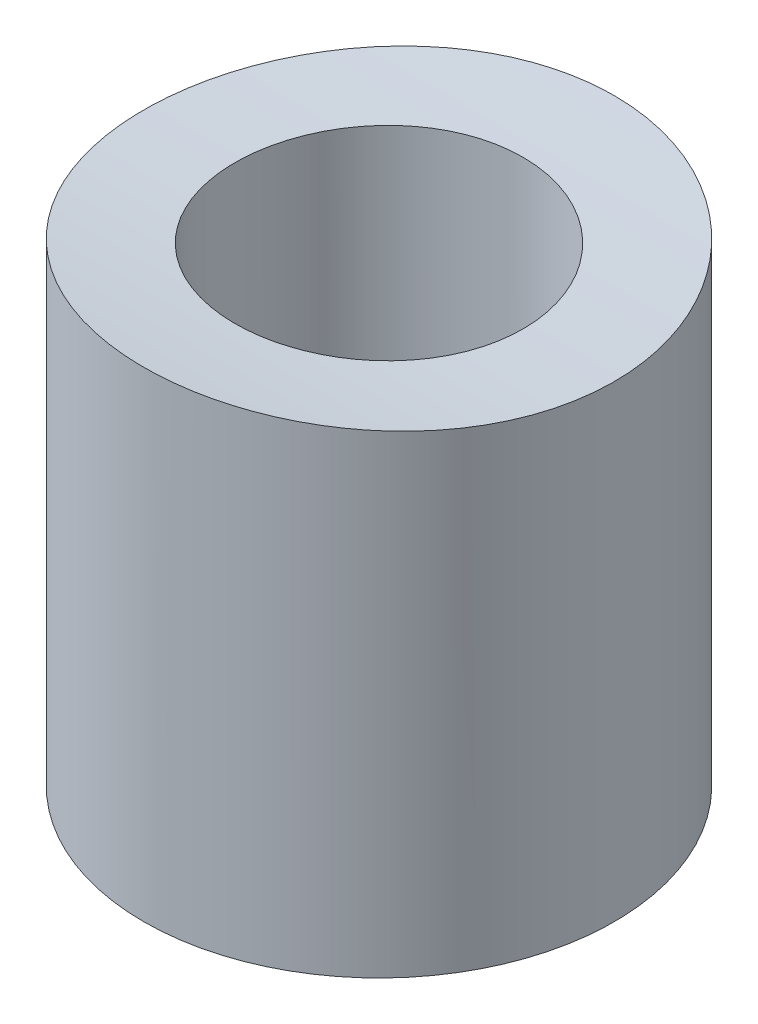
ISO-10303-21;
HEADER;
FILE_DESCRIPTION(('STEP AP214'),'2;1');
FILE_NAME('part.step','',(''),(''),'','','');
FILE_SCHEMA(('AUTOMOTIVE_DESIGN { 1 0 10303 214 1 1 1 1 }'));
ENDSEC;
DATA;
#1=APPLICATION_CONTEXT('core data for automotive mechanical design processes');
#2=APPLICATION_PROTOCOL_DEFINITION('international standard','automotive_design',2000,#1);
#3=PRODUCT_CONTEXT('',#1,'mechanical');
#4=PRODUCT('Part','Part','',(#3));
#5=PRODUCT_RELATED_PRODUCT_CATEGORY('part','',(#4));
#6=PRODUCT_DEFINITION_FORMATION('','',#4);
#7=PRODUCT_DEFINITION_CONTEXT('part definition',#1,'design');
#8=PRODUCT_DEFINITION('design','',#6,#7);
#9=PRODUCT_DEFINITION_SHAPE('','',#8);
#10=(LENGTH_UNIT() NAMED_UNIT(*) SI_UNIT(.MILLI.,.METRE.));
#11=(NAMED_UNIT(*) PLANE_ANGLE_UNIT() SI_UNIT($,.RADIAN.));
#12=(NAMED_UNIT(*) SI_UNIT($,.STERADIAN.) SOLID_ANGLE_UNIT());
#13=UNCERTAINTY_MEASURE_WITH_UNIT(LENGTH_MEASURE(1.E-05),#10,'distance_accuracy_value','');
#14=(GEOMETRIC_REPRESENTATION_CONTEXT(3) GLOBAL_UNCERTAINTY_ASSIGNED_CONTEXT((#13)) GLOBAL_UNIT_ASSIGNED_CONTEXT((#10,
#11,#12)) REPRESENTATION_CONTEXT('',''));
#15=CARTESIAN_POINT('',(0.,0.,0.));
#16=DIRECTION('',(0.,0.,1.));
#17=DIRECTION('',(1.,0.,0.));
#18=AXIS2_PLACEMENT_3D('',#15,#16,#17);
#19=CARTESIAN_POINT('',(0.,50.,0.));
#20=DIRECTION('',(0.,-1.,0.));
#21=DIRECTION('',(0.,0.,-1.));
#22=AXIS2_PLACEMENT_3D('',#19,#20,#21);
#23=CYLINDRICAL_SURFACE('',#22,24.5);
#24=CARTESIAN_POINT('',(0.,0.,0.));
#25=DIRECTION('',(0.,1.,0.));
#26=DIRECTION('',(0.,0.,1.));
#27=AXIS2_PLACEMENT_3D('',#24,#25,#26);
#28=CIRCLE('',#27,24.5);
#29=CARTESIAN_POINT('',(0.,0.,24.5));
#30=VERTEX_POINT('',#29);
#31=EDGE_CURVE('E10',#30,#30,#28,.T.);
#32=ORIENTED_EDGE('',*,*,#31,.T.);
#33=EDGE_LOOP('',(#32));
#34=FACE_BOUND('',#33,.T.);
#35=CARTESIAN_POINT('',(0.,50.,-24.5));
#36=CARTESIAN_POINT('',(0.686288295087626,50.000002021148,-24.5000069532155));
#37=CARTESIAN_POINT('',(1.37247124156527,49.9969460440604,-24.4711529936711));
#38=CARTESIAN_POINT('',(2.74016006663346,49.9848132793735,-24.3559528357226));
#39=CARTESIAN_POINT('',(3.42166479599907,49.9757350623454,-24.2695929877989));
#40=CARTESIAN_POINT('',(4.77558400723465,49.951802620348,-24.0398792992395));
#41=CARTESIAN_POINT('',(5.44798869914994,49.9369426184239,-23.8964684520386));
#42=CARTESIAN_POINT('',(6.77820592212142,49.9018751925709,-23.5537176918179));
#43=CARTESIAN_POINT('',(7.43601931533568,49.8816680855044,-23.3543810928407));
#44=CARTESIAN_POINT('',(8.73204165634782,49.8364976322271,-22.9013623837873));
#45=CARTESIAN_POINT('',(9.37026217391306,49.8115371581928,-22.647713080187));
#46=CARTESIAN_POINT('',(10.6230325562134,49.7575624516799,-22.0878227479932));
#47=CARTESIAN_POINT('',(11.2375820906608,49.7285481626634,-21.7815809858881));
#48=CARTESIAN_POINT('',(12.4385749002095,49.6672953134469,-21.1187638864147));
#49=CARTESIAN_POINT('',(13.0250239045276,49.6350574146588,-20.7621988680895));
#50=CARTESIAN_POINT('',(14.1658613855054,49.5682630934088,-20.0012131228647));
#51=CARTESIAN_POINT('',(14.7202498772364,49.5337066720367,-19.5967924184617));
#52=CARTESIAN_POINT('',(15.7950254687789,49.4631224763038,-18.7414127627031));
#53=CARTESIAN_POINT('',(16.3152843210596,49.4270898961834,-18.290293057645));
#54=CARTESIAN_POINT('',(17.3159877670831,49.3546884752986,-17.3458899272557));
#55=CARTESIAN_POINT('',(17.7964322375206,49.3183196334931,-16.8526063713525));
#56=CARTESIAN_POINT('',(18.7141556477563,49.2462709571884,-15.8273105849728));
#57=CARTESIAN_POINT('',(19.1514326070483,49.2105911543623,-15.2952965795043));
#58=CARTESIAN_POINT('',(19.9797134160076,49.1409290090768,-14.1962854554133));
#59=CARTESIAN_POINT('',(20.3707172445091,49.1069466673939,-13.6292883207894));
#60=CARTESIAN_POINT('',(21.1045316340148,49.0415623550901,-12.4629276259589));
#61=CARTESIAN_POINT('',(21.4472278904996,49.0101665752785,-11.8634917946458));
#62=CARTESIAN_POINT('',(22.0808825238466,48.9509347928541,-10.6376993684122));
#63=CARTESIAN_POINT('',(22.3718407937438,48.9230987976009,-10.0113427178381));
#64=CARTESIAN_POINT('',(22.8999042614955,48.8717783078774,-8.73616644082469));
#65=CARTESIAN_POINT('',(23.1370105884944,48.8482937221706,-8.08734728569842));
#66=CARTESIAN_POINT('',(23.555643231069,48.8063440843154,-6.77186128294522));
#67=CARTESIAN_POINT('',(23.7371697659061,48.7878790123652,-6.10519450573816));
#68=CARTESIAN_POINT('',(24.0427369466796,48.7565532741183,-4.76129163738858));
#69=CARTESIAN_POINT('',(24.1669886133669,48.7436720456101,-4.08410400265386));
#70=CARTESIAN_POINT('',(24.3580824086558,48.7237797530405,-2.72159084120125));
#71=CARTESIAN_POINT('',(24.4249246646663,48.7167686759516,-2.03626533254718));
#72=CARTESIAN_POINT('',(24.5007045245883,48.708815811678,-0.662402567701231));
#73=CARTESIAN_POINT('',(24.509643591478,48.7078738711509,0.0261346069050318));
#74=CARTESIAN_POINT('',(24.4695546474667,48.7120856435205,1.40149975460566));
#75=CARTESIAN_POINT('',(24.4205267584797,48.7172393435971,2.08832773129171));
#76=CARTESIAN_POINT('',(24.2651754634394,48.7334637780303,3.45264750029517));
#77=CARTESIAN_POINT('',(24.1590793588644,48.7445110370481,4.13016546915855));
#78=CARTESIAN_POINT('',(23.8905152784563,48.7721967600294,5.47381574641876));
#79=CARTESIAN_POINT('',(23.7280474752404,48.7888352068719,6.13994808967322));
#80=CARTESIAN_POINT('',(23.3479199768433,48.8272359181457,7.45612812557251));
#81=CARTESIAN_POINT('',(23.1302597329422,48.848998233518,8.10617565823259));
#82=CARTESIAN_POINT('',(22.6413193083486,48.8970361015369,9.38560961562939));
#83=CARTESIAN_POINT('',(22.3700389715758,48.9233116673208,10.0149959802183));
#84=CARTESIAN_POINT('',(21.7752263394678,48.9796946694264,11.2498941527251));
#85=CARTESIAN_POINT('',(21.4515941885255,49.0098094048281,11.8553575281662));
#86=CARTESIAN_POINT('',(20.7547573686808,49.0729857997939,13.0368880159689));
#87=CARTESIAN_POINT('',(20.381552658981,49.1060474617832,13.6129551041374));
#88=CARTESIAN_POINT('',(19.5881959355555,49.1741918673254,14.7316951369586));
#89=CARTESIAN_POINT('',(19.1680426375792,49.2092746661525,15.2743671674796));
#90=CARTESIAN_POINT('',(18.2837436995033,49.2804775272068,16.3225266697561));
#91=CARTESIAN_POINT('',(17.8195979098088,49.316597592961,16.8280140150562));
#92=CARTESIAN_POINT('',(16.8482062869191,49.3890373820541,17.8006354408805));
#93=CARTESIAN_POINT('',(16.3407627552299,49.425357225729,18.2675720870252));
#94=CARTESIAN_POINT('',(15.2882910641227,49.4969924207639,19.1570582316902));
#95=CARTESIAN_POINT('',(14.7432627757846,49.5323077686776,19.5796075779441));
#96=CARTESIAN_POINT('',(13.6194474707038,49.6009307474872,20.3773275832249));
#97=CARTESIAN_POINT('',(13.0406603283777,49.6342383709133,20.7524980659853));
#98=CARTESIAN_POINT('',(11.8534013624187,49.6978965266922,21.4527823208908));
#99=CARTESIAN_POINT('',(11.2449295803382,49.728247063184,21.7778961631022));
#100=CARTESIAN_POINT('',(10.0024393899622,49.7851302141949,22.3758048354382));
#101=CARTESIAN_POINT('',(9.36841461074177,49.8116618689504,22.6485865191293));
#102=CARTESIAN_POINT('',(8.079459738756,49.8601360860988,23.1397491209017));
#103=CARTESIAN_POINT('',(7.42452963097305,49.882078645195,23.3581299999026));
#104=CARTESIAN_POINT('',(6.0984540907896,49.9207414587406,23.7388859486836));
#105=CARTESIAN_POINT('',(5.42730910662739,49.937461857372,23.9012625647346));
#106=CARTESIAN_POINT('',(4.07359783989122,49.9651974422214,24.1688192657932));
#107=CARTESIAN_POINT('',(3.39103160498689,49.9762126522454,24.2739995894635));
#108=CARTESIAN_POINT('',(2.02266685989173,49.9921803614176,24.4260197099533));
#109=CARTESIAN_POINT('',(1.33689937172294,49.9971615741104,24.4731358314165));
#110=CARTESIAN_POINT('',(-0.0361858201459552,50.0010138059953,24.5095972921728));
#111=CARTESIAN_POINT('',(-0.723503518931741,49.9998848445301,24.4989428143479));
#112=CARTESIAN_POINT('',(-2.09476754544308,49.9915492862662,24.4199425798202));
#113=CARTESIAN_POINT('',(-2.77871392137327,49.9843427766219,24.3515976504211));
#114=CARTESIAN_POINT('',(-4.13836372862933,49.9640594378516,24.1577214211123));
#115=CARTESIAN_POINT('',(-4.81406716292025,49.9509826108373,24.0321901417736));
#116=CARTESIAN_POINT('',(-6.15085406236045,49.9193710577616,23.7252229486231));
#117=CARTESIAN_POINT('',(-6.81196804814646,49.9008491795039,23.5439185872906));
#118=CARTESIAN_POINT('',(-8.11654143695496,49.8588638100581,23.1266246338166));
#119=CARTESIAN_POINT('',(-8.76000087709147,49.8354003292593,22.8906351566461));
#120=CARTESIAN_POINT('',(-10.0247631713222,49.7841972418134,22.365664290455));
#121=CARTESIAN_POINT('',(-10.6460655918761,49.7564575515512,22.0766818652146));
#122=CARTESIAN_POINT('',(-11.862164232587,49.6974867729908,21.4477892995129));
#123=CARTESIAN_POINT('',(-12.4569603499025,49.666255671148,21.1078789614791));
#124=CARTESIAN_POINT('',(-13.6180885503395,49.6010595810744,20.3781648538815));
#125=CARTESIAN_POINT('',(-14.1843052852959,49.5670847614584,19.988178413555));
#126=CARTESIAN_POINT('',(-15.2819103872984,49.497464908402,19.162072338339));
#127=CARTESIAN_POINT('',(-15.8132986771984,49.4618198712623,18.7259526012685));
#128=CARTESIAN_POINT('',(-16.837551218441,49.3898641761319,17.8106318189078));
#129=CARTESIAN_POINT('',(-17.3304145367236,49.3535535020461,17.3314297307836));
#130=CARTESIAN_POINT('',(-18.2741595731634,49.2812895560201,16.3333040785543));
#131=CARTESIAN_POINT('',(-18.7250412028156,49.2453362848336,15.8143804307131));
#132=CARTESIAN_POINT('',(-19.5833733251471,49.1746572065135,14.7382853097414));
#133=CARTESIAN_POINT('',(-19.9906430726756,49.1399368782562,14.1809692883665));
#134=CARTESIAN_POINT('',(-20.7567813543668,49.0728597444314,13.0338686233771));
#135=CARTESIAN_POINT('',(-21.1156497394478,49.0405029461441,12.4440838797633));
#136=CARTESIAN_POINT('',(-21.7824098108955,48.9790710099709,11.2362135595772));
#137=CARTESIAN_POINT('',(-22.0903020377916,48.949995837289,10.6181282831805));
#138=CARTESIAN_POINT('',(-22.6528884835789,48.8959526209958,9.35803005540812));
#139=CARTESIAN_POINT('',(-22.9075828622048,48.8709845650521,8.71601717588558));
#140=CARTESIAN_POINT('',(-23.3614715855176,48.8259101324642,7.41391160105119));
#141=CARTESIAN_POINT('',(-23.5607738482252,48.8057943126727,6.75385685252208));
#142=CARTESIAN_POINT('',(-23.903080806881,48.770932279093,5.4191666535326));
#143=CARTESIAN_POINT('',(-24.0460855507534,48.7561860607338,4.74453121548481));
#144=CARTESIAN_POINT('',(-24.2747397940875,48.7324829342095,3.38552647151113));
#145=CARTESIAN_POINT('',(-24.36039079402,48.7235258745905,2.7011574207114));
#146=CARTESIAN_POINT('',(-24.4737083718094,48.7116555588347,1.3275841522817));
#147=CARTESIAN_POINT('',(-24.5013751494492,48.7087422818743,0.638379951319286));
#148=CARTESIAN_POINT('',(-24.4985265642779,48.7090416509301,-0.736578971896539));
#149=CARTESIAN_POINT('',(-24.4682912021538,48.7122248160395,-1.4223342974242));
#150=CARTESIAN_POINT('',(-24.3504146177206,48.7245688676449,-2.78883680721785));
#151=CARTESIAN_POINT('',(-24.2627735931409,48.7337297335511,-3.46958400872578));
#152=CARTESIAN_POINT('',(-24.0307292308482,48.7577708320923,-4.82122928006036));
#153=CARTESIAN_POINT('',(-23.886325975377,48.7726510564407,-5.49212736415575));
#154=CARTESIAN_POINT('',(-23.5418114282073,48.8077117969717,-6.81932187737274));
#155=CARTESIAN_POINT('',(-23.3417000572625,48.8278923206942,-7.47561828572162));
#156=CARTESIAN_POINT('',(-22.8872601545618,48.8729822940255,-8.76886501621954));
#157=CARTESIAN_POINT('',(-22.6329411048227,48.8978909165112,-9.40581869956853));
#158=CARTESIAN_POINT('',(-22.0718933652162,48.951740553946,-10.6560300439151));
#159=CARTESIAN_POINT('',(-21.7651647018264,48.980681566858,-11.2692877168839));
#160=CARTESIAN_POINT('',(-21.1014855008815,49.0417852502316,-12.4678203714861));
#161=CARTESIAN_POINT('',(-20.7445353692673,49.0739478946521,-13.0530955792511));
#162=CARTESIAN_POINT('',(-19.9829323522153,49.1405955652681,-14.1915988215973));
#163=CARTESIAN_POINT('',(-19.5782793198539,49.1750805986163,-14.744826757466));
#164=CARTESIAN_POINT('',(-18.7221257143071,49.2455723951675,-15.8178790171138));
#165=CARTESIAN_POINT('',(-18.2704166750137,49.2815854713245,-16.337536611247));
#166=CARTESIAN_POINT('',(-17.3248907962421,49.3539670580277,-17.3369951008173));
#167=CARTESIAN_POINT('',(-16.8310736767229,49.3903355709363,-17.8167957311427));
#168=CARTESIAN_POINT('',(-15.8046689696591,49.4624095511725,-18.7332836387584));
#169=CARTESIAN_POINT('',(-15.2720719348614,49.4981148542575,-19.1699603490833));
#170=CARTESIAN_POINT('',(-14.171952822366,49.5678418385998,-19.9969824227977));
#171=CARTESIAN_POINT('',(-13.6044312308585,49.6018635432829,-20.3873284309427));
#172=CARTESIAN_POINT('',(-12.4368192607528,49.6673483890508,-21.1199393229403));
#173=CARTESIAN_POINT('',(-11.8366431746644,49.6988041961988,-21.4620682890849));
#174=CARTESIAN_POINT('',(-10.6093742603877,49.7581527717657,-22.0945190578318));
#175=CARTESIAN_POINT('',(-9.98227974989461,49.7860453170591,-22.3848376166047));
#176=CARTESIAN_POINT('',(-8.7063017059696,49.8374362125418,-22.9112651274558));
#177=CARTESIAN_POINT('',(-8.05744129347745,49.8609390615961,-23.1474296375362));
#178=CARTESIAN_POINT('',(-6.74217302496232,49.9029043169061,-23.5641472570516));
#179=CARTESIAN_POINT('',(-6.07576949168322,49.9213679523447,-23.7447139294896));
#180=CARTESIAN_POINT('',(-4.51745969110148,49.9576731534451,-24.0970111935597));
#181=CARTESIAN_POINT('',(-3.62073424733472,49.973481024199,-24.2479847816403));
#182=CARTESIAN_POINT('',(-1.81594437883966,49.994643085689,-24.4494743462838));
#183=CARTESIAN_POINT('',(-0.907880008181916,49.999997326255,-24.4999908017004));
#184=CARTESIAN_POINT('',(0.,50.,-24.5));
#185=B_SPLINE_CURVE_WITH_KNOTS('',3,(#35,#36,#37,#38,#39,#40,#41,#42,#43,#44,#45,#46,#47,#48,
#49,#50,#51,#52,#53,#54,#55,#56,#57,#58,#59,#60,#61,#62,#63,#64,#65,#66,#67,#68,#69,#70,#71,#72,
#73,#74,#75,#76,#77,#78,#79,#80,#81,#82,#83,#84,#85,#86,#87,#88,#89,#90,#91,#92,#93,#94,#95,#96,
#97,#98,#99,#100,#101,#102,#103,#104,#105,#106,#107,#108,#109,#110,#111,#112,#113,#114,#115,
#116,#117,#118,#119,#120,#121,#122,#123,#124,#125,#126,#127,#128,#129,#130,#131,#132,#133,#134,
#135,#136,#137,#138,#139,#140,#141,#142,#143,#144,#145,#146,#147,#148,#149,#150,#151,#152,#153,
#154,#155,#156,#157,#158,#159,#160,#161,#162,#163,#164,#165,#166,#167,#168,#169,#170,#171,#172,
#173,#174,#175,#176,#177,#178,#179,#180,#181,#182,#183,#184),.UNSPECIFIED.,.T.,.F.,(4,2,2,2,2,2,
2,2,2,2,2,2,2,2,2,2,2,2,2,2,2,2,2,2,2,2,2,2,2,2,2,2,2,2,2,2,2,2,2,2,2,2,2,2,2,2,2,2,2,2,2,2,2,2,
2,2,2,2,2,2,2,2,2,2,2,2,2,2,2,2,2,2,2,2,4),(0.,2.05807077298954,4.1166302210786,
6.17725181281669,8.23775132222966,10.2970097224939,12.3562968457515,14.4151623134378,
16.4740268132664,18.5402304446741,20.6064404748814,22.6727452578709,24.7390509860014,
26.8101667232872,28.8812867424165,30.9523633311809,33.0234317494744,35.0868074043514,
37.1501784799612,39.2134974223654,41.2768120252744,43.3319686937356,45.3871190691093,
47.442289877467,49.4974666682129,51.5566107456382,53.6157565177164,55.67495863029,
57.734167745356,59.8033416818622,61.872522716239,63.9417114484879,66.0108972843816,
68.0806022445889,70.1503086916273,72.2199579897503,74.2895986517938,76.3493514804807,
78.4090977886974,80.4688145598405,82.5285305900653,84.583425124647,86.6383153390222,
88.6932457388426,90.7481841108756,92.8108437107706,94.8735078793596,96.9362219894103,
98.9989404479403,101.069901294473,103.140868519648,105.211813783762,107.282752829461,
109.349628412105,111.416502235281,113.483321983432,115.550134610404,117.606977865608,
119.663814036209,121.72064722671,123.777483343126,125.833959972227,127.890435562394,
129.946894530994,132.003359833594,134.069357855347,136.135369618151,138.201886381093,
140.268374382235,142.340575775021,144.412906862041,146.483102284295,148.552792284854,
151.275394768733,153.997984274623),.UNSPECIFIED.);
#186=CARTESIAN_POINT('',(0.,50.,-24.5));
#187=VERTEX_POINT('',#186);
#188=EDGE_CURVE('E50',#187,#187,#185,.T.);
#189=ORIENTED_EDGE('',*,*,#188,.T.);
#190=EDGE_LOOP('',(#189));
#191=FACE_BOUND('',#190,.T.);
#192=ADVANCED_FACE('F33',(#34,#191),#23,.T.);
#193=CARTESIAN_POINT('',(0.,0.,0.));
#194=DIRECTION('',(0.,1.,0.));
#195=DIRECTION('',(0.,0.,1.));
#196=AXIS2_PLACEMENT_3D('',#193,#194,#195);
#197=PLANE('',#196);
#198=ORIENTED_EDGE('',*,*,#31,.F.);
#199=EDGE_LOOP('',(#198));
#200=FACE_BOUND('',#199,.T.);
#201=CARTESIAN_POINT('',(0.,0.,0.));
#202=DIRECTION('',(0.,1.,0.));
#203=DIRECTION('',(0.,0.,1.));
#204=AXIS2_PLACEMENT_3D('',#201,#202,#203);
#205=CIRCLE('',#204,15.);
#206=CARTESIAN_POINT('',(0.,0.,15.));
#207=VERTEX_POINT('',#206);
#208=EDGE_CURVE('E46',#207,#207,#205,.T.);
#209=ORIENTED_EDGE('',*,*,#208,.T.);
#210=EDGE_LOOP('',(#209));
#211=FACE_BOUND('',#210,.T.);
#212=ADVANCED_FACE('F65',(#200,#211),#197,.F.);
#213=CARTESIAN_POINT('',(0.,50.,0.));
#214=DIRECTION('',(0.,-1.,0.));
#215=DIRECTION('',(0.,0.,-1.));
#216=AXIS2_PLACEMENT_3D('',#213,#214,#215);
#217=CYLINDRICAL_SURFACE('',#216,15.);
#218=CARTESIAN_POINT('',(0.,49.1920129506309,-15.));
#219=CARTESIAN_POINT('',(0.420960552750272,49.1920135703289,-15.0000034668767));
#220=CARTESIAN_POINT('',(0.841865918849,49.1908678656692,-14.9822721765936));
#221=CARTESIAN_POINT('',(1.68081882851771,49.1863185794692,-14.9114740197579));
#222=CARTESIAN_POINT('',(2.0988656205385,49.1829144255993,-14.8583981962835));
#223=CARTESIAN_POINT('',(2.92941451470333,49.1739392610025,-14.7172066007687));
#224=CARTESIAN_POINT('',(3.34191041301893,49.1683660054134,-14.6290545252425));
#225=CARTESIAN_POINT('',(4.15798741447332,49.155211987891,-14.4183469519501));
#226=CARTESIAN_POINT('',(4.56156854199932,49.14763123145,-14.2957915483102));
#227=CARTESIAN_POINT('',(5.35673278970193,49.1306827274235,-14.017231934575));
#228=CARTESIAN_POINT('',(5.74832226336083,49.1213159458193,-13.8612458000423));
#229=CARTESIAN_POINT('',(6.51696363272833,49.101058841591,-13.516898072164));
#230=CARTESIAN_POINT('',(6.89401530881498,49.0901684959619,-13.3285359899506));
#231=CARTESIAN_POINT('',(7.63082178520857,49.0671761838936,-12.920827952852));
#232=CARTESIAN_POINT('',(7.99058064555503,49.0550745039307,-12.7014893187951));
#233=CARTESIAN_POINT('',(8.69035708846856,49.0300002643968,-12.2333520946494));
#234=CARTESIAN_POINT('',(9.03037472262114,49.0170277071015,-11.984553581547));
#235=CARTESIAN_POINT('',(9.68873396148959,48.9905601930413,-11.458888367522));
#236=CARTESIAN_POINT('',(10.0070445281106,48.9770645298017,-11.1819828282765));
#237=CARTESIAN_POINT('',(10.6192163687354,48.9499504799103,-10.6023546970016));
#238=CARTESIAN_POINT('',(10.9130775987995,48.9363320930382,-10.2996320585762));
#239=CARTESIAN_POINT('',(11.4742829509626,48.909357853534,-9.67049782621025));
#240=CARTESIAN_POINT('',(11.7416259742097,48.8960020117997,-9.3440852515844));
#241=CARTESIAN_POINT('',(12.2478863039321,48.8699317322706,-8.66988989708526));
#242=CARTESIAN_POINT('',(12.4868036092468,48.857217294502,-8.32210711633944));
#243=CARTESIAN_POINT('',(12.9347066597103,48.832779518057,-7.60732525817114));
#244=CARTESIAN_POINT('',(13.1436666528574,48.821057035593,-7.24031001372959));
#245=CARTESIAN_POINT('',(13.5299205919245,48.7989480565359,-6.48993920086993));
#246=CARTESIAN_POINT('',(13.70721451309,48.7885615609872,-6.10658361967831));
#247=CARTESIAN_POINT('',(14.0288649626142,48.769419627532,-5.32625921653098));
#248=CARTESIAN_POINT('',(14.1732217900373,48.7606641748159,-4.92929051821816));
#249=CARTESIAN_POINT('',(14.4279626116936,48.7450330454883,-4.12456229802463));
#250=CARTESIAN_POINT('',(14.5383466559148,48.7381573661108,-3.71680279202259));
#251=CARTESIAN_POINT('',(14.7242164582408,48.7264894634768,-2.89397631013979));
#252=CARTESIAN_POINT('',(14.7997507936524,48.7216943406739,-2.47892034830795));
#253=CARTESIAN_POINT('',(14.9156042974061,48.7143096393671,-1.64390293341354));
#254=CARTESIAN_POINT('',(14.9559234951531,48.7117200590215,-1.22394148444739));
#255=CARTESIAN_POINT('',(15.0010555466793,48.7088199679713,-0.382111655155977));
#256=CARTESIAN_POINT('',(15.0058687790767,48.7085094329639,0.0397567047869135));
#257=CARTESIAN_POINT('',(14.9799551199481,48.7101761877566,0.882395721156238));
#258=CARTESIAN_POINT('',(14.9492282563234,48.7121534757605,1.30316637844418));
#259=CARTESIAN_POINT('',(14.8525282004854,48.7183351349401,2.13998805866822));
#260=CARTESIAN_POINT('',(14.7866073520001,48.7225361986334,2.55604515600003));
#261=CARTESIAN_POINT('',(14.6200261546362,48.7330444985073,3.38111795497941));
#262=CARTESIAN_POINT('',(14.5193658456044,48.7393517322722,3.79013366470301));
#263=CARTESIAN_POINT('',(14.2840270395941,48.7538940432498,4.59822483389018));
#264=CARTESIAN_POINT('',(14.1493483866542,48.7621291293009,4.99730024777197));
#265=CARTESIAN_POINT('',(13.8469360500511,48.7802944037054,5.78268387740634));
#266=CARTESIAN_POINT('',(13.6792023295645,48.7902245939473,6.16899207893561));
#267=CARTESIAN_POINT('',(13.3117390665491,48.8115075275756,6.92639194173802));
#268=CARTESIAN_POINT('',(13.1119858998516,48.822861319948,7.29747211177791));
#269=CARTESIAN_POINT('',(12.6819937158021,48.8466647436719,8.02149050281336));
#270=CARTESIAN_POINT('',(12.4517546886386,48.8591143753759,8.37442871797016));
#271=CARTESIAN_POINT('',(11.9624210211796,48.8847578588792,9.05967649021718));
#272=CARTESIAN_POINT('',(11.7033260905983,48.8979517181645,9.39198583973193));
#273=CARTESIAN_POINT('',(11.1581149800064,48.9247108237255,10.0336290070437));
#274=CARTESIAN_POINT('',(10.8719987655135,48.938276070475,10.3429627955204));
#275=CARTESIAN_POINT('',(10.2742226262288,48.965419283265,10.9370118621864));
#276=CARTESIAN_POINT('',(9.96251729048313,48.9789972277165,11.2216814475349));
#277=CARTESIAN_POINT('',(9.31622047477443,49.005755928463,11.7637545974575));
#278=CARTESIAN_POINT('',(8.98162896526587,49.0189366842451,12.0211581268307));
#279=CARTESIAN_POINT('',(8.29192749559553,49.0445267098317,12.5068717001538));
#280=CARTESIAN_POINT('',(7.93681751062343,49.0569359787033,12.7351817089238));
#281=CARTESIAN_POINT('',(7.20859453985644,49.0806301967555,13.1610823811179));
#282=CARTESIAN_POINT('',(6.83548156398524,49.0919151465559,13.3586730614751));
#283=CARTESIAN_POINT('',(6.07387425641332,49.1130401238325,13.7217355820997));
#284=CARTESIAN_POINT('',(5.68537895791221,49.122880060304,13.8872053996559));
#285=CARTESIAN_POINT('',(4.89578907690297,49.1408335866347,14.1848248621368));
#286=CARTESIAN_POINT('',(4.49469449125715,49.148947176064,14.3169744987636));
#287=CARTESIAN_POINT('',(3.68276546011623,49.1632162598838,14.5470021632233));
#288=CARTESIAN_POINT('',(3.27193111414727,49.1693717742737,14.6448805410973));
#289=CARTESIAN_POINT('',(2.443448658325,49.1795488345113,14.8056616280448));
#290=CARTESIAN_POINT('',(2.02580055896583,49.1835703836453,14.8685643909805));
#291=CARTESIAN_POINT('',(1.1874261058608,49.1893592655263,14.958858812701));
#292=CARTESIAN_POINT('',(0.766706617504148,49.1911306288203,14.9863139669159));
#293=CARTESIAN_POINT('',(-0.0755536242164615,49.1923818829859,15.0057234353659));
#294=CARTESIAN_POINT('',(-0.497094376603717,49.191861776581,14.9976777917953));
#295=CARTESIAN_POINT('',(-1.33799236545291,49.1885449424475,14.9461438856248));
#296=CARTESIAN_POINT('',(-1.75734961352325,49.1857482268349,14.9026558116456));
#297=CARTESIAN_POINT('',(-2.59089735793937,49.1779579545748,14.7805506909404));
#298=CARTESIAN_POINT('',(-3.00508785487822,49.1729643981796,14.7019336482469));
#299=CARTESIAN_POINT('',(-3.82500787944859,49.1609278933723,14.5102178025948));
#300=CARTESIAN_POINT('',(-4.230744294419,49.1538866891631,14.3971483425844));
#301=CARTESIAN_POINT('',(-5.03124264836558,49.137953397622,14.1373149933833));
#302=CARTESIAN_POINT('',(-5.42600459579274,49.1290613117154,13.9905511301402));
#303=CARTESIAN_POINT('',(-6.20176445429984,49.1096785837073,13.6643758615867));
#304=CARTESIAN_POINT('',(-6.58276226259797,49.0991879296718,13.484964212544));
#305=CARTESIAN_POINT('',(-7.32830084658377,49.0769054625466,13.0947709850151));
#306=CARTESIAN_POINT('',(-7.69284159807318,49.0651136475437,12.8839893604049));
#307=CARTESIAN_POINT('',(-8.40340082380801,49.0405451610211,12.432230346594));
#308=CARTESIAN_POINT('',(-8.749392227889,49.0277671131539,12.1912104537775));
#309=CARTESIAN_POINT('',(-9.41984988439536,49.0016031124184,11.6809206003449));
#310=CARTESIAN_POINT('',(-9.7443161185967,48.9882171590352,11.4116506158117));
#311=CARTESIAN_POINT('',(-10.3694354090653,48.9612163115547,10.8467635119623));
#312=CARTESIAN_POINT('',(-10.6700882459354,48.9476014153494,10.5511461499562));
#313=CARTESIAN_POINT('',(-11.2454536236953,48.9205280911182,9.93565507816297));
#314=CARTESIAN_POINT('',(-11.5201661446689,48.9070696632124,9.61578134975278));
#315=CARTESIAN_POINT('',(-12.042092273817,48.8806705347248,8.95354762585687));
#316=CARTESIAN_POINT('',(-12.2892647319227,48.8677306269041,8.61115516552012));
#317=CARTESIAN_POINT('',(-12.7538859557098,48.8427567087849,7.9067322186623));
#318=CARTESIAN_POINT('',(-12.9713346874422,48.8307226995211,7.54470170971234));
#319=CARTESIAN_POINT('',(-13.3749565717307,48.8079021597182,6.80357124862165));
#320=CARTESIAN_POINT('',(-13.5611298749638,48.797115623169,6.42447137872792));
#321=CARTESIAN_POINT('',(-13.9008699364174,48.777096245258,5.65189257569557));
#322=CARTESIAN_POINT('',(-14.0544367318784,48.7678634021215,5.25841365898012));
#323=CARTESIAN_POINT('',(-14.3277563614857,48.7512201304081,4.46018270656578));
#324=CARTESIAN_POINT('',(-14.4475351096393,48.7438083057529,4.05543957325007));
#325=CARTESIAN_POINT('',(-14.6525744523859,48.7310082796301,3.23727072389786));
#326=CARTESIAN_POINT('',(-14.737835058796,48.7256200774699,2.82384501083383));
#327=CARTESIAN_POINT('',(-14.8732228370106,48.717020393844,1.99126145644296));
#328=CARTESIAN_POINT('',(-14.923350313013,48.7138088935315,1.57210366477896));
#329=CARTESIAN_POINT('',(-14.9881108811963,48.7096538139164,0.731044013359841));
#330=CARTESIAN_POINT('',(-15.0027440184563,48.7087102317335,0.309142157090464));
#331=CARTESIAN_POINT('',(-14.9964160703746,48.7091174182064,-0.533629449055477));
#332=CARTESIAN_POINT('',(-14.9755193198095,48.710464039939,-0.954499685448011));
#333=CARTESIAN_POINT('',(-14.8984052047742,48.7154055502323,-1.79297797587672));
#334=CARTESIAN_POINT('',(-14.8421878859037,48.7190004358904,-2.21058603412374));
#335=CARTESIAN_POINT('',(-14.6948370816753,48.7283366907373,-3.0395716839474));
#336=CARTESIAN_POINT('',(-14.6037035637727,48.734078061927,-3.45094926971636));
#337=CARTESIAN_POINT('',(-14.3871747101543,48.7475448042955,-4.26455310578384));
#338=CARTESIAN_POINT('',(-14.2617793553352,48.7552701765805,-4.66677935097972));
#339=CARTESIAN_POINT('',(-13.9776265160984,48.7724863218081,-5.45922460065192));
#340=CARTESIAN_POINT('',(-13.8188694367395,48.7819770733163,-5.84944375084545));
#341=CARTESIAN_POINT('',(-13.4691254112199,48.8024558088415,-6.61511950575284));
#342=CARTESIAN_POINT('',(-13.278138466293,48.8134437928011,-6.99057611103172));
#343=CARTESIAN_POINT('',(-12.8652988625632,48.8366063396387,-7.72406573416122));
#344=CARTESIAN_POINT('',(-12.6434470387033,48.848780870416,-8.08209922298066));
#345=CARTESIAN_POINT('',(-12.1704468184534,48.8739730887151,-8.77822911444393));
#346=CARTESIAN_POINT('',(-11.919298406348,48.8869907766891,-9.11632550639283));
#347=CARTESIAN_POINT('',(-11.3890323224751,48.9135243634491,-9.77075259320378));
#348=CARTESIAN_POINT('',(-11.1098680780897,48.9270410673979,-10.0870455199233));
#349=CARTESIAN_POINT('',(-10.5259005965752,48.9541691365591,-10.695002354538));
#350=CARTESIAN_POINT('',(-10.2210972322859,48.9677805022407,-10.9866661402678));
#351=CARTESIAN_POINT('',(-9.58792822396504,48.9947155721933,-11.5433696005929));
#352=CARTESIAN_POINT('',(-9.2595566964363,49.0080392035475,-11.8084025872347));
#353=CARTESIAN_POINT('',(-8.58164657592937,49.0340171043881,-12.3098781515357));
#354=CARTESIAN_POINT('',(-8.23210830354767,49.0466713840071,-12.5463211620629));
#355=CARTESIAN_POINT('',(-7.51386549734185,49.0709672121398,-12.9892287508377));
#356=CARTESIAN_POINT('',(-7.14513665956754,49.0826074239469,-13.1956539935098));
#357=CARTESIAN_POINT('',(-6.39155069723354,49.1045248314516,-13.576684257085));
#358=CARTESIAN_POINT('',(-6.00669352703614,49.1148020232921,-13.7512891879399));
#359=CARTESIAN_POINT('',(-5.22398983759866,49.1336899880124,-14.0672613026679));
#360=CARTESIAN_POINT('',(-4.82615734524391,49.1423024949814,-14.2086631073373));
#361=CARTESIAN_POINT('',(-4.02009036861349,49.1576269420514,-14.4574126856945));
#362=CARTESIAN_POINT('',(-3.61185857300485,49.1643393680767,-14.5647691669372));
#363=CARTESIAN_POINT('',(-2.67479571247896,49.1772265483325,-14.7693622791986));
#364=CARTESIAN_POINT('',(-2.14355702149592,49.1827505225054,-14.8557740934067));
#365=CARTESIAN_POINT('',(-1.0748489035644,49.1901433254013,-14.9710906982797));
#366=CARTESIAN_POINT('',(-0.537379485869468,49.192012159552,-14.9999955743396));
#367=CARTESIAN_POINT('',(0.,49.1920129506309,-15.));
#368=B_SPLINE_CURVE_WITH_KNOTS('',3,(#218,#219,#220,#221,#222,#223,#224,#225,#226,#227,#228,
#229,#230,#231,#232,#233,#234,#235,#236,#237,#238,#239,#240,#241,#242,#243,#244,#245,#246,#247,
#248,#249,#250,#251,#252,#253,#254,#255,#256,#257,#258,#259,#260,#261,#262,#263,#264,#265,#266,
#267,#268,#269,#270,#271,#272,#273,#274,#275,#276,#277,#278,#279,#280,#281,#282,#283,#284,#285,
#286,#287,#288,#289,#290,#291,#292,#293,#294,#295,#296,#297,#298,#299,#300,#301,#302,#303,#304,
#305,#306,#307,#308,#309,#310,#311,#312,#313,#314,#315,#316,#317,#318,#319,#320,#321,#322,#323,
#324,#325,#326,#327,#328,#329,#330,#331,#332,#333,#334,#335,#336,#337,#338,#339,#340,#341,#342,
#343,#344,#345,#346,#347,#348,#349,#350,#351,#352,#353,#354,#355,#356,#357,#358,#359,#360,#361,
#362,#363,#364,#365,#366,#367),.UNSPECIFIED.,.T.,.F.,(4,2,2,2,2,2,2,2,2,2,2,2,2,2,2,2,2,2,2,2,2,
2,2,2,2,2,2,2,2,2,2,2,2,2,2,2,2,2,2,2,2,2,2,2,2,2,2,2,2,2,2,2,2,2,2,2,2,2,2,2,2,2,2,2,2,2,2,2,2,
2,2,2,2,2,4),(0.,1.26241203731292,2.52514411368967,3.78918651573312,5.05322545943872,
6.31658267018108,7.57995895894122,8.84303716638781,10.106112073155,11.3709566924715,
12.635803584889,13.9007028677013,15.1656022021591,16.4315824361758,17.6975636598477,
18.9635333881252,20.2295012536301,21.4936991043535,22.7578958994613,24.0220792137722,
25.2862615356159,26.5485688659589,27.8108747484202,29.0731864181903,30.335499494189,
31.5987482369806,32.8619973863305,34.125259244912,35.388522715584,36.6540785790488,
37.9196360763482,39.1851951039536,40.4507534339591,41.7163914327245,42.9820297466834,
44.2476551332347,45.5132785707267,46.7766318041042,48.039983535935,49.3033285443927,
50.5666734078331,51.8289452802982,53.0912161807102,54.3534965050077,55.6157786852872,
56.8798554664599,58.1439333178342,59.4080228140318,60.6721132807565,61.9380679014108,
63.2040239679593,64.4699739352778,65.7359224567242,67.0008973927152,68.265871895652,
69.5308354457617,70.7957973893225,72.0584712760282,73.3211435325952,74.5838169660792,
75.846491103593,77.1091499113393,78.3718086707588,79.6344332799395,80.897058566429,
82.1618187080414,83.426585122752,84.6916683761767,85.9567324731432,87.2234396658078,
88.4901504430659,89.7555345009859,91.0205946582008,92.6321360117108,94.2436749721537),.UNSPECIFIED.);
#369=CARTESIAN_POINT('',(0.,49.1920129506309,-15.));
#370=VERTEX_POINT('',#369);
#371=EDGE_CURVE('E37',#370,#370,#368,.T.);
#372=ORIENTED_EDGE('',*,*,#371,.F.);
#373=EDGE_LOOP('',(#372));
#374=FACE_BOUND('',#373,.T.);
#375=ORIENTED_EDGE('',*,*,#208,.F.);
#376=EDGE_LOOP('',(#375));
#377=FACE_BOUND('',#376,.T.);
#378=ADVANCED_FACE('F60',(#374,#377),#217,.F.);
#379=CARTESIAN_POINT('',(-24.5,281.808886801175,0.));
#380=DIRECTION('',(1.,0.,0.));
#381=DIRECTION('',(0.,0.,-1.));
#382=AXIS2_PLACEMENT_3D('',#379,#380,#381);
#383=CYLINDRICAL_SURFACE('',#382,233.1);
#384=ORIENTED_EDGE('',*,*,#371,.T.);
#385=EDGE_LOOP('',(#384));
#386=FACE_BOUND('',#385,.T.);
#387=ORIENTED_EDGE('',*,*,#188,.F.);
#388=EDGE_LOOP('',(#387));
#389=FACE_BOUND('',#388,.T.);
#390=ADVANCED_FACE('F57',(#386,#389),#383,.F.);
#391=CLOSED_SHELL('',(#192,#212,#378,#390));
#392=MANIFOLD_SOLID_BREP('B2',#391);
#393=ADVANCED_BREP_SHAPE_REPRESENTATION('',(#18,#392),#14);
#394=SHAPE_DEFINITION_REPRESENTATION(#9,#393);
ENDSEC;
END-ISO-10303-21;
